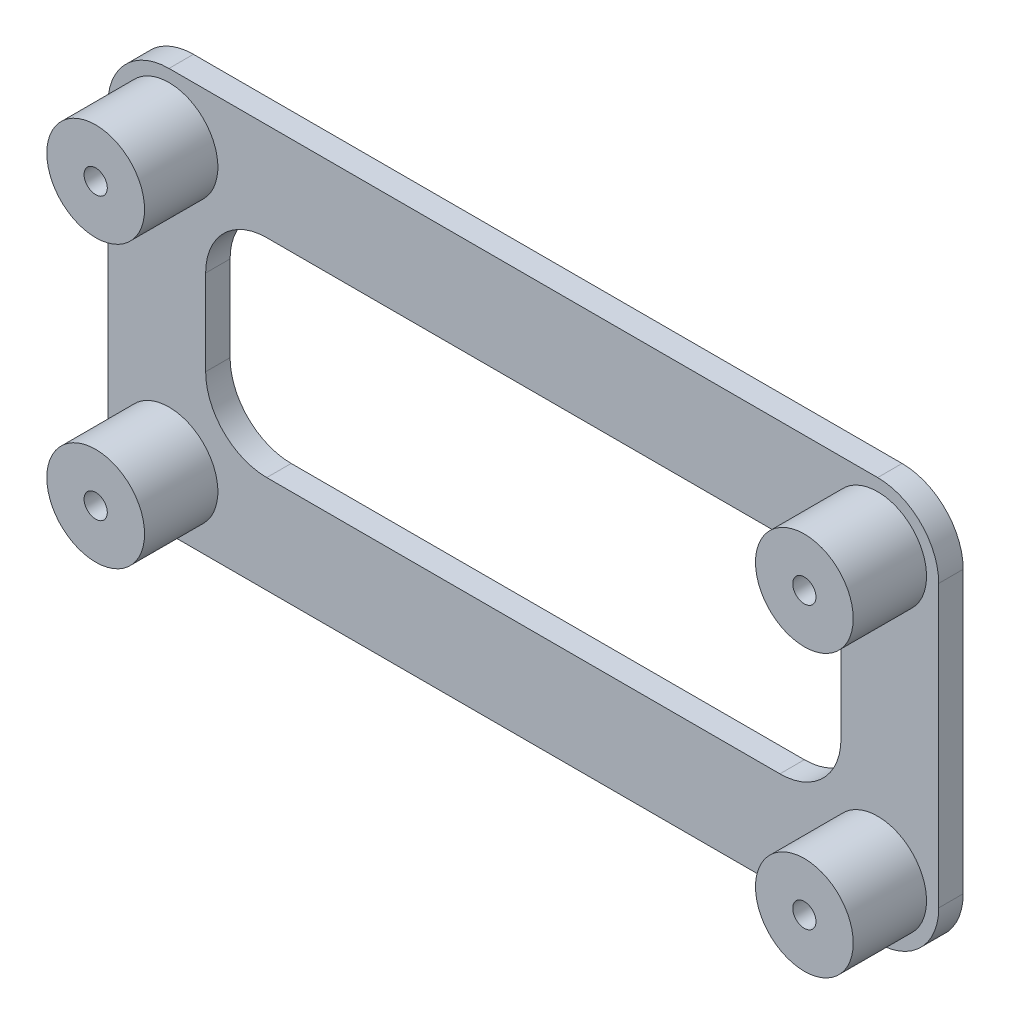
ISO-10303-21;
HEADER;
FILE_DESCRIPTION(('STEP AP214'),'2;1');
FILE_NAME('part.step','',(''),(''),'','','');
FILE_SCHEMA(('AUTOMOTIVE_DESIGN { 1 0 10303 214 1 1 1 1 }'));
ENDSEC;
DATA;
#1=APPLICATION_CONTEXT('core data for automotive mechanical design processes');
#2=APPLICATION_PROTOCOL_DEFINITION('international standard','automotive_design',2000,#1);
#3=PRODUCT_CONTEXT('',#1,'mechanical');
#4=PRODUCT('Part','Part','',(#3));
#5=PRODUCT_RELATED_PRODUCT_CATEGORY('part','',(#4));
#6=PRODUCT_DEFINITION_FORMATION('','',#4);
#7=PRODUCT_DEFINITION_CONTEXT('part definition',#1,'design');
#8=PRODUCT_DEFINITION('design','',#6,#7);
#9=PRODUCT_DEFINITION_SHAPE('','',#8);
#10=(LENGTH_UNIT() NAMED_UNIT(*) SI_UNIT(.MILLI.,.METRE.));
#11=(NAMED_UNIT(*) PLANE_ANGLE_UNIT() SI_UNIT($,.RADIAN.));
#12=(NAMED_UNIT(*) SI_UNIT($,.STERADIAN.) SOLID_ANGLE_UNIT());
#13=UNCERTAINTY_MEASURE_WITH_UNIT(LENGTH_MEASURE(1.E-05),#10,'distance_accuracy_value','');
#14=(GEOMETRIC_REPRESENTATION_CONTEXT(3) GLOBAL_UNCERTAINTY_ASSIGNED_CONTEXT((#13)) GLOBAL_UNIT_ASSIGNED_CONTEXT((#10,
#11,#12)) REPRESENTATION_CONTEXT('',''));
#15=CARTESIAN_POINT('',(0.,0.,0.));
#16=DIRECTION('',(0.,0.,1.));
#17=DIRECTION('',(1.,0.,0.));
#18=AXIS2_PLACEMENT_3D('',#15,#16,#17);
#19=CARTESIAN_POINT('',(0.,0.,2.));
#20=DIRECTION('',(0.,0.,-1.));
#21=DIRECTION('',(-1.,0.,0.));
#22=AXIS2_PLACEMENT_3D('',#19,#20,#21);
#23=PLANE('',#22);
#24=CARTESIAN_POINT('',(29.,-11.5,2.));
#25=DIRECTION('',(0.,0.,-1.));
#26=DIRECTION('',(-1.,0.,0.));
#27=AXIS2_PLACEMENT_3D('',#24,#25,#26);
#28=CIRCLE('',#27,4.);
#29=CARTESIAN_POINT('',(25.,-11.5,2.));
#30=VERTEX_POINT('',#29);
#31=EDGE_CURVE('E187',#30,#30,#28,.F.);
#32=ORIENTED_EDGE('',*,*,#31,.F.);
#33=EDGE_LOOP('',(#32));
#34=FACE_BOUND('',#33,.T.);
#35=CARTESIAN_POINT('',(-29.,11.5,2.));
#36=DIRECTION('',(0.,0.,-1.));
#37=DIRECTION('',(-1.,0.,0.));
#38=AXIS2_PLACEMENT_3D('',#35,#36,#37);
#39=CIRCLE('',#38,4.);
#40=CARTESIAN_POINT('',(-33.,11.5,2.));
#41=VERTEX_POINT('',#40);
#42=EDGE_CURVE('E325',#41,#41,#39,.F.);
#43=ORIENTED_EDGE('',*,*,#42,.F.);
#44=EDGE_LOOP('',(#43));
#45=FACE_BOUND('',#44,.T.);
#46=DIRECTION('',(-1.,0.,0.));
#47=VECTOR('',#46,1.);
#48=CARTESIAN_POINT('',(-34.,16.5,2.));
#49=LINE('',#48,#47);
#50=CARTESIAN_POINT('',(29.,16.5,2.));
#51=VERTEX_POINT('',#50);
#52=CARTESIAN_POINT('',(-29.,16.5,2.));
#53=VERTEX_POINT('',#52);
#54=EDGE_CURVE('E314',#51,#53,#49,.T.);
#55=ORIENTED_EDGE('',*,*,#54,.T.);
#56=CARTESIAN_POINT('',(-29.,11.5,2.));
#57=DIRECTION('',(0.,0.,-1.));
#58=DIRECTION('',(-1.,0.,0.));
#59=AXIS2_PLACEMENT_3D('',#56,#57,#58);
#60=CIRCLE('',#59,5.);
#61=CARTESIAN_POINT('',(-34.,11.5,2.));
#62=VERTEX_POINT('',#61);
#63=EDGE_CURVE('E244',#53,#62,#60,.F.);
#64=ORIENTED_EDGE('',*,*,#63,.T.);
#65=DIRECTION('',(0.,-1.,0.));
#66=VECTOR('',#65,1.);
#67=CARTESIAN_POINT('',(-34.,-16.5,2.));
#68=LINE('',#67,#66);
#69=CARTESIAN_POINT('',(-34.,-11.5,2.));
#70=VERTEX_POINT('',#69);
#71=EDGE_CURVE('E319',#62,#70,#68,.T.);
#72=ORIENTED_EDGE('',*,*,#71,.T.);
#73=CARTESIAN_POINT('',(-29.,-11.5,2.));
#74=DIRECTION('',(0.,0.,-1.));
#75=DIRECTION('',(-1.,0.,0.));
#76=AXIS2_PLACEMENT_3D('',#73,#74,#75);
#77=CIRCLE('',#76,5.);
#78=CARTESIAN_POINT('',(-29.,-16.5,2.));
#79=VERTEX_POINT('',#78);
#80=EDGE_CURVE('E62',#70,#79,#77,.F.);
#81=ORIENTED_EDGE('',*,*,#80,.T.);
#82=DIRECTION('',(1.,0.,0.));
#83=VECTOR('',#82,1.);
#84=CARTESIAN_POINT('',(-34.,-16.5,2.));
#85=LINE('',#84,#83);
#86=CARTESIAN_POINT('',(29.,-16.5,2.));
#87=VERTEX_POINT('',#86);
#88=EDGE_CURVE('E322',#79,#87,#85,.T.);
#89=ORIENTED_EDGE('',*,*,#88,.T.);
#90=CARTESIAN_POINT('',(29.,-11.5,2.));
#91=DIRECTION('',(0.,0.,-1.));
#92=DIRECTION('',(-1.,0.,0.));
#93=AXIS2_PLACEMENT_3D('',#90,#91,#92);
#94=CIRCLE('',#93,5.);
#95=CARTESIAN_POINT('',(34.,-11.5,2.));
#96=VERTEX_POINT('',#95);
#97=EDGE_CURVE('E238',#87,#96,#94,.F.);
#98=ORIENTED_EDGE('',*,*,#97,.T.);
#99=DIRECTION('',(0.,1.,0.));
#100=VECTOR('',#99,1.);
#101=CARTESIAN_POINT('',(34.,-16.5,2.));
#102=LINE('',#101,#100);
#103=CARTESIAN_POINT('',(34.,11.5,2.));
#104=VERTEX_POINT('',#103);
#105=EDGE_CURVE('E310',#96,#104,#102,.T.);
#106=ORIENTED_EDGE('',*,*,#105,.T.);
#107=CARTESIAN_POINT('',(29.,11.5,2.));
#108=DIRECTION('',(0.,0.,-1.));
#109=DIRECTION('',(-1.,0.,0.));
#110=AXIS2_PLACEMENT_3D('',#107,#108,#109);
#111=CIRCLE('',#110,5.);
#112=EDGE_CURVE('E241',#104,#51,#111,.F.);
#113=ORIENTED_EDGE('',*,*,#112,.T.);
#114=EDGE_LOOP('',(#55,#64,#72,#81,#89,#98,#106,#113));
#115=FACE_BOUND('',#114,.T.);
#116=DIRECTION('',(0.,1.,0.));
#117=VECTOR('',#116,1.);
#118=CARTESIAN_POINT('',(26.,-8.5,2.));
#119=LINE('',#118,#117);
#120=CARTESIAN_POINT('',(26.,-3.5,2.));
#121=VERTEX_POINT('',#120);
#122=CARTESIAN_POINT('',(26.,3.5,2.));
#123=VERTEX_POINT('',#122);
#124=EDGE_CURVE('E282',#121,#123,#119,.T.);
#125=ORIENTED_EDGE('',*,*,#124,.F.);
#126=CARTESIAN_POINT('',(21.,-3.5,2.));
#127=DIRECTION('',(0.,0.,-1.));
#128=DIRECTION('',(-1.,0.,0.));
#129=AXIS2_PLACEMENT_3D('',#126,#127,#128);
#130=CIRCLE('',#129,5.);
#131=CARTESIAN_POINT('',(21.,-8.5,2.));
#132=VERTEX_POINT('',#131);
#133=EDGE_CURVE('E269',#121,#132,#130,.T.);
#134=ORIENTED_EDGE('',*,*,#133,.T.);
#135=DIRECTION('',(1.,0.,0.));
#136=VECTOR('',#135,1.);
#137=CARTESIAN_POINT('',(-26.,-8.5,2.));
#138=LINE('',#137,#136);
#139=CARTESIAN_POINT('',(-21.,-8.5,2.));
#140=VERTEX_POINT('',#139);
#141=EDGE_CURVE('E331',#140,#132,#138,.T.);
#142=ORIENTED_EDGE('',*,*,#141,.F.);
#143=CARTESIAN_POINT('',(-21.,-3.5,2.));
#144=DIRECTION('',(0.,0.,-1.));
#145=DIRECTION('',(-1.,0.,0.));
#146=AXIS2_PLACEMENT_3D('',#143,#144,#145);
#147=CIRCLE('',#146,5.);
#148=CARTESIAN_POINT('',(-26.,-3.5,2.));
#149=VERTEX_POINT('',#148);
#150=EDGE_CURVE('E263',#140,#149,#147,.T.);
#151=ORIENTED_EDGE('',*,*,#150,.T.);
#152=DIRECTION('',(0.,-1.,0.));
#153=VECTOR('',#152,1.);
#154=CARTESIAN_POINT('',(-26.,-8.5,2.));
#155=LINE('',#154,#153);
#156=CARTESIAN_POINT('',(-26.,3.5,2.));
#157=VERTEX_POINT('',#156);
#158=EDGE_CURVE('E703',#157,#149,#155,.T.);
#159=ORIENTED_EDGE('',*,*,#158,.F.);
#160=CARTESIAN_POINT('',(-21.,3.5,2.));
#161=DIRECTION('',(0.,0.,-1.));
#162=DIRECTION('',(-1.,0.,0.));
#163=AXIS2_PLACEMENT_3D('',#160,#161,#162);
#164=CIRCLE('',#163,5.);
#165=CARTESIAN_POINT('',(-21.,8.5,2.));
#166=VERTEX_POINT('',#165);
#167=EDGE_CURVE('E11',#157,#166,#164,.T.);
#168=ORIENTED_EDGE('',*,*,#167,.T.);
#169=DIRECTION('',(-1.,0.,0.));
#170=VECTOR('',#169,1.);
#171=CARTESIAN_POINT('',(-26.,8.5,2.));
#172=LINE('',#171,#170);
#173=CARTESIAN_POINT('',(21.,8.5,2.));
#174=VERTEX_POINT('',#173);
#175=EDGE_CURVE('E285',#174,#166,#172,.T.);
#176=ORIENTED_EDGE('',*,*,#175,.F.);
#177=CARTESIAN_POINT('',(21.,3.5,2.));
#178=DIRECTION('',(0.,0.,-1.));
#179=DIRECTION('',(-1.,0.,0.));
#180=AXIS2_PLACEMENT_3D('',#177,#178,#179);
#181=CIRCLE('',#180,5.);
#182=EDGE_CURVE('E165',#174,#123,#181,.T.);
#183=ORIENTED_EDGE('',*,*,#182,.T.);
#184=EDGE_LOOP('',(#125,#134,#142,#151,#159,#168,#176,#183));
#185=FACE_BOUND('',#184,.T.);
#186=CARTESIAN_POINT('',(29.,11.5,2.));
#187=DIRECTION('',(0.,0.,-1.));
#188=DIRECTION('',(-1.,0.,0.));
#189=AXIS2_PLACEMENT_3D('',#186,#187,#188);
#190=CIRCLE('',#189,4.);
#191=CARTESIAN_POINT('',(25.,11.5,2.));
#192=VERTEX_POINT('',#191);
#193=EDGE_CURVE('E344',#192,#192,#190,.F.);
#194=ORIENTED_EDGE('',*,*,#193,.F.);
#195=EDGE_LOOP('',(#194));
#196=FACE_BOUND('',#195,.T.);
#197=CARTESIAN_POINT('',(-29.,-11.5,2.));
#198=DIRECTION('',(0.,0.,-1.));
#199=DIRECTION('',(-1.,0.,0.));
#200=AXIS2_PLACEMENT_3D('',#197,#198,#199);
#201=CIRCLE('',#200,4.);
#202=CARTESIAN_POINT('',(-33.,-11.5,2.));
#203=VERTEX_POINT('',#202);
#204=EDGE_CURVE('E180',#203,#203,#201,.F.);
#205=ORIENTED_EDGE('',*,*,#204,.F.);
#206=EDGE_LOOP('',(#205));
#207=FACE_BOUND('',#206,.T.);
#208=ADVANCED_FACE('F39',(#34,#45,#115,#185,#196,#207),#23,.F.);
#209=CARTESIAN_POINT('',(0.,0.,0.));
#210=DIRECTION('',(0.,0.,-1.));
#211=DIRECTION('',(-1.,0.,0.));
#212=AXIS2_PLACEMENT_3D('',#209,#210,#211);
#213=PLANE('',#212);
#214=CARTESIAN_POINT('',(29.,-11.5,0.));
#215=DIRECTION('',(0.,0.,1.));
#216=DIRECTION('',(1.,0.,0.));
#217=AXIS2_PLACEMENT_3D('',#214,#215,#216);
#218=CIRCLE('',#217,0.950000000000001);
#219=CARTESIAN_POINT('',(29.95,-11.5,0.));
#220=VERTEX_POINT('',#219);
#221=EDGE_CURVE('E691',#220,#220,#218,.T.);
#222=ORIENTED_EDGE('',*,*,#221,.T.);
#223=EDGE_LOOP('',(#222));
#224=FACE_BOUND('',#223,.T.);
#225=CARTESIAN_POINT('',(-29.,11.5,0.));
#226=DIRECTION('',(0.,0.,1.));
#227=DIRECTION('',(1.,0.,0.));
#228=AXIS2_PLACEMENT_3D('',#225,#226,#227);
#229=CIRCLE('',#228,0.950000000000001);
#230=CARTESIAN_POINT('',(-28.05,11.5,0.));
#231=VERTEX_POINT('',#230);
#232=EDGE_CURVE('E303',#231,#231,#229,.T.);
#233=ORIENTED_EDGE('',*,*,#232,.T.);
#234=EDGE_LOOP('',(#233));
#235=FACE_BOUND('',#234,.T.);
#236=DIRECTION('',(0.,-1.,0.));
#237=VECTOR('',#236,1.);
#238=CARTESIAN_POINT('',(-34.,-16.5,0.));
#239=LINE('',#238,#237);
#240=CARTESIAN_POINT('',(-34.,11.5,0.));
#241=VERTEX_POINT('',#240);
#242=CARTESIAN_POINT('',(-34.,-11.5,0.));
#243=VERTEX_POINT('',#242);
#244=EDGE_CURVE('E335',#241,#243,#239,.T.);
#245=ORIENTED_EDGE('',*,*,#244,.F.);
#246=CARTESIAN_POINT('',(-29.,11.5,0.));
#247=DIRECTION('',(0.,0.,-1.));
#248=DIRECTION('',(-1.,0.,0.));
#249=AXIS2_PLACEMENT_3D('',#246,#247,#248);
#250=CIRCLE('',#249,5.);
#251=CARTESIAN_POINT('',(-29.,16.5,0.));
#252=VERTEX_POINT('',#251);
#253=EDGE_CURVE('E226',#241,#252,#250,.T.);
#254=ORIENTED_EDGE('',*,*,#253,.T.);
#255=DIRECTION('',(-1.,0.,0.));
#256=VECTOR('',#255,1.);
#257=CARTESIAN_POINT('',(-34.,16.5,0.));
#258=LINE('',#257,#256);
#259=CARTESIAN_POINT('',(29.,16.5,0.));
#260=VERTEX_POINT('',#259);
#261=EDGE_CURVE('E330',#260,#252,#258,.T.);
#262=ORIENTED_EDGE('',*,*,#261,.F.);
#263=CARTESIAN_POINT('',(29.,11.5,0.));
#264=DIRECTION('',(0.,0.,-1.));
#265=DIRECTION('',(-1.,0.,0.));
#266=AXIS2_PLACEMENT_3D('',#263,#264,#265);
#267=CIRCLE('',#266,5.);
#268=CARTESIAN_POINT('',(34.,11.5,0.));
#269=VERTEX_POINT('',#268);
#270=EDGE_CURVE('E223',#260,#269,#267,.T.);
#271=ORIENTED_EDGE('',*,*,#270,.T.);
#272=DIRECTION('',(0.,1.,0.));
#273=VECTOR('',#272,1.);
#274=CARTESIAN_POINT('',(34.,-16.5,0.));
#275=LINE('',#274,#273);
#276=CARTESIAN_POINT('',(34.,-11.5,0.));
#277=VERTEX_POINT('',#276);
#278=EDGE_CURVE('E326',#277,#269,#275,.T.);
#279=ORIENTED_EDGE('',*,*,#278,.F.);
#280=CARTESIAN_POINT('',(29.,-11.5,0.));
#281=DIRECTION('',(0.,0.,-1.));
#282=DIRECTION('',(-1.,0.,0.));
#283=AXIS2_PLACEMENT_3D('',#280,#281,#282);
#284=CIRCLE('',#283,5.);
#285=CARTESIAN_POINT('',(29.,-16.5,0.));
#286=VERTEX_POINT('',#285);
#287=EDGE_CURVE('E220',#277,#286,#284,.T.);
#288=ORIENTED_EDGE('',*,*,#287,.T.);
#289=DIRECTION('',(1.,0.,0.));
#290=VECTOR('',#289,1.);
#291=CARTESIAN_POINT('',(-34.,-16.5,0.));
#292=LINE('',#291,#290);
#293=CARTESIAN_POINT('',(-29.,-16.5,0.));
#294=VERTEX_POINT('',#293);
#295=EDGE_CURVE('E315',#294,#286,#292,.T.);
#296=ORIENTED_EDGE('',*,*,#295,.F.);
#297=CARTESIAN_POINT('',(-29.,-11.5,0.));
#298=DIRECTION('',(0.,0.,-1.));
#299=DIRECTION('',(-1.,0.,0.));
#300=AXIS2_PLACEMENT_3D('',#297,#298,#299);
#301=CIRCLE('',#300,5.);
#302=EDGE_CURVE('E217',#294,#243,#301,.T.);
#303=ORIENTED_EDGE('',*,*,#302,.T.);
#304=EDGE_LOOP('',(#245,#254,#262,#271,#279,#288,#296,#303));
#305=FACE_BOUND('',#304,.T.);
#306=DIRECTION('',(0.,-1.,0.));
#307=VECTOR('',#306,1.);
#308=CARTESIAN_POINT('',(-26.,-8.5,0.));
#309=LINE('',#308,#307);
#310=CARTESIAN_POINT('',(-26.,3.5,0.));
#311=VERTEX_POINT('',#310);
#312=CARTESIAN_POINT('',(-26.,-3.5,0.));
#313=VERTEX_POINT('',#312);
#314=EDGE_CURVE('E157',#311,#313,#309,.T.);
#315=ORIENTED_EDGE('',*,*,#314,.T.);
#316=CARTESIAN_POINT('',(-21.,-3.5,0.));
#317=DIRECTION('',(0.,0.,-1.));
#318=DIRECTION('',(-1.,0.,0.));
#319=AXIS2_PLACEMENT_3D('',#316,#317,#318);
#320=CIRCLE('',#319,5.);
#321=CARTESIAN_POINT('',(-21.,-8.5,0.));
#322=VERTEX_POINT('',#321);
#323=EDGE_CURVE('E260',#313,#322,#320,.F.);
#324=ORIENTED_EDGE('',*,*,#323,.T.);
#325=DIRECTION('',(1.,0.,0.));
#326=VECTOR('',#325,1.);
#327=CARTESIAN_POINT('',(-26.,-8.5,0.));
#328=LINE('',#327,#326);
#329=CARTESIAN_POINT('',(21.,-8.5,0.));
#330=VERTEX_POINT('',#329);
#331=EDGE_CURVE('E175',#322,#330,#328,.T.);
#332=ORIENTED_EDGE('',*,*,#331,.T.);
#333=CARTESIAN_POINT('',(21.,-3.5,0.));
#334=DIRECTION('',(0.,0.,-1.));
#335=DIRECTION('',(-1.,0.,0.));
#336=AXIS2_PLACEMENT_3D('',#333,#334,#335);
#337=CIRCLE('',#336,5.);
#338=CARTESIAN_POINT('',(26.,-3.5,0.));
#339=VERTEX_POINT('',#338);
#340=EDGE_CURVE('E266',#330,#339,#337,.F.);
#341=ORIENTED_EDGE('',*,*,#340,.T.);
#342=DIRECTION('',(0.,1.,0.));
#343=VECTOR('',#342,1.);
#344=CARTESIAN_POINT('',(26.,-8.5,0.));
#345=LINE('',#344,#343);
#346=CARTESIAN_POINT('',(26.,3.5,0.));
#347=VERTEX_POINT('',#346);
#348=EDGE_CURVE('E297',#339,#347,#345,.T.);
#349=ORIENTED_EDGE('',*,*,#348,.T.);
#350=CARTESIAN_POINT('',(21.,3.5,0.));
#351=DIRECTION('',(0.,0.,-1.));
#352=DIRECTION('',(-1.,0.,0.));
#353=AXIS2_PLACEMENT_3D('',#350,#351,#352);
#354=CIRCLE('',#353,5.);
#355=CARTESIAN_POINT('',(21.,8.5,0.));
#356=VERTEX_POINT('',#355);
#357=EDGE_CURVE('E272',#347,#356,#354,.F.);
#358=ORIENTED_EDGE('',*,*,#357,.T.);
#359=DIRECTION('',(-1.,0.,0.));
#360=VECTOR('',#359,1.);
#361=CARTESIAN_POINT('',(-26.,8.5,0.));
#362=LINE('',#361,#360);
#363=CARTESIAN_POINT('',(-21.,8.5,0.));
#364=VERTEX_POINT('',#363);
#365=EDGE_CURVE('E159',#356,#364,#362,.T.);
#366=ORIENTED_EDGE('',*,*,#365,.T.);
#367=CARTESIAN_POINT('',(-21.,3.5,0.));
#368=DIRECTION('',(0.,0.,-1.));
#369=DIRECTION('',(-1.,0.,0.));
#370=AXIS2_PLACEMENT_3D('',#367,#368,#369);
#371=CIRCLE('',#370,5.);
#372=EDGE_CURVE('E48',#364,#311,#371,.F.);
#373=ORIENTED_EDGE('',*,*,#372,.T.);
#374=EDGE_LOOP('',(#315,#324,#332,#341,#349,#358,#366,#373));
#375=FACE_BOUND('',#374,.T.);
#376=CARTESIAN_POINT('',(29.,11.5,0.));
#377=DIRECTION('',(0.,0.,1.));
#378=DIRECTION('',(1.,0.,0.));
#379=AXIS2_PLACEMENT_3D('',#376,#377,#378);
#380=CIRCLE('',#379,0.950000000000001);
#381=CARTESIAN_POINT('',(29.95,11.5,0.));
#382=VERTEX_POINT('',#381);
#383=EDGE_CURVE('E695',#382,#382,#380,.T.);
#384=ORIENTED_EDGE('',*,*,#383,.T.);
#385=EDGE_LOOP('',(#384));
#386=FACE_BOUND('',#385,.T.);
#387=CARTESIAN_POINT('',(-29.,-11.5,0.));
#388=DIRECTION('',(0.,0.,1.));
#389=DIRECTION('',(1.,0.,0.));
#390=AXIS2_PLACEMENT_3D('',#387,#388,#389);
#391=CIRCLE('',#390,0.950000000000001);
#392=CARTESIAN_POINT('',(-28.05,-11.5,0.));
#393=VERTEX_POINT('',#392);
#394=EDGE_CURVE('E681',#393,#393,#391,.T.);
#395=ORIENTED_EDGE('',*,*,#394,.T.);
#396=EDGE_LOOP('',(#395));
#397=FACE_BOUND('',#396,.T.);
#398=ADVANCED_FACE('F155',(#224,#235,#305,#375,#386,#397),#213,.T.);
#399=CARTESIAN_POINT('',(34.,-16.5,2.));
#400=DIRECTION('',(-1.,0.,0.));
#401=DIRECTION('',(0.,0.,1.));
#402=AXIS2_PLACEMENT_3D('',#399,#400,#401);
#403=PLANE('',#402);
#404=ORIENTED_EDGE('',*,*,#278,.T.);
#405=DIRECTION('',(0.,0.,-1.));
#406=VECTOR('',#405,1.);
#407=CARTESIAN_POINT('',(34.,11.5,2.));
#408=LINE('',#407,#406);
#409=EDGE_CURVE('E251',#269,#104,#408,.F.);
#410=ORIENTED_EDGE('',*,*,#409,.T.);
#411=ORIENTED_EDGE('',*,*,#105,.F.);
#412=DIRECTION('',(0.,0.,-1.));
#413=VECTOR('',#412,1.);
#414=CARTESIAN_POINT('',(34.,-11.5,2.));
#415=LINE('',#414,#413);
#416=EDGE_CURVE('E247',#96,#277,#415,.T.);
#417=ORIENTED_EDGE('',*,*,#416,.T.);
#418=EDGE_LOOP('',(#404,#410,#411,#417));
#419=FACE_BOUND('',#418,.T.);
#420=ADVANCED_FACE('F384',(#419),#403,.F.);
#421=CARTESIAN_POINT('',(-34.,16.5,2.));
#422=DIRECTION('',(0.,-1.,0.));
#423=DIRECTION('',(0.,0.,-1.));
#424=AXIS2_PLACEMENT_3D('',#421,#422,#423);
#425=PLANE('',#424);
#426=ORIENTED_EDGE('',*,*,#261,.T.);
#427=DIRECTION('',(0.,0.,-1.));
#428=VECTOR('',#427,1.);
#429=CARTESIAN_POINT('',(-29.,16.5,2.));
#430=LINE('',#429,#428);
#431=EDGE_CURVE('E233',#252,#53,#430,.F.);
#432=ORIENTED_EDGE('',*,*,#431,.T.);
#433=ORIENTED_EDGE('',*,*,#54,.F.);
#434=DIRECTION('',(0.,0.,-1.));
#435=VECTOR('',#434,1.);
#436=CARTESIAN_POINT('',(29.,16.5,2.));
#437=LINE('',#436,#435);
#438=EDGE_CURVE('E229',#51,#260,#437,.T.);
#439=ORIENTED_EDGE('',*,*,#438,.T.);
#440=EDGE_LOOP('',(#426,#432,#433,#439));
#441=FACE_BOUND('',#440,.T.);
#442=ADVANCED_FACE('F388',(#441),#425,.F.);
#443=CARTESIAN_POINT('',(-34.,-16.5,2.));
#444=DIRECTION('',(1.,0.,0.));
#445=DIRECTION('',(0.,0.,-1.));
#446=AXIS2_PLACEMENT_3D('',#443,#444,#445);
#447=PLANE('',#446);
#448=ORIENTED_EDGE('',*,*,#71,.F.);
#449=DIRECTION('',(0.,0.,-1.));
#450=VECTOR('',#449,1.);
#451=CARTESIAN_POINT('',(-34.,11.5,2.));
#452=LINE('',#451,#450);
#453=EDGE_CURVE('E213',#62,#241,#452,.T.);
#454=ORIENTED_EDGE('',*,*,#453,.T.);
#455=ORIENTED_EDGE('',*,*,#244,.T.);
#456=DIRECTION('',(0.,0.,-1.));
#457=VECTOR('',#456,1.);
#458=CARTESIAN_POINT('',(-34.,-11.5,2.));
#459=LINE('',#458,#457);
#460=EDGE_CURVE('E210',#243,#70,#459,.F.);
#461=ORIENTED_EDGE('',*,*,#460,.T.);
#462=EDGE_LOOP('',(#448,#454,#455,#461));
#463=FACE_BOUND('',#462,.T.);
#464=ADVANCED_FACE('F369',(#463),#447,.F.);
#465=CARTESIAN_POINT('',(-34.,-16.5,2.));
#466=DIRECTION('',(0.,1.,0.));
#467=DIRECTION('',(0.,0.,1.));
#468=AXIS2_PLACEMENT_3D('',#465,#466,#467);
#469=PLANE('',#468);
#470=ORIENTED_EDGE('',*,*,#295,.T.);
#471=DIRECTION('',(0.,0.,-1.));
#472=VECTOR('',#471,1.);
#473=CARTESIAN_POINT('',(29.,-16.5,2.));
#474=LINE('',#473,#472);
#475=EDGE_CURVE('E55',#286,#87,#474,.F.);
#476=ORIENTED_EDGE('',*,*,#475,.T.);
#477=ORIENTED_EDGE('',*,*,#88,.F.);
#478=DIRECTION('',(0.,0.,-1.));
#479=VECTOR('',#478,1.);
#480=CARTESIAN_POINT('',(-29.,-16.5,2.));
#481=LINE('',#480,#479);
#482=EDGE_CURVE('E254',#79,#294,#481,.T.);
#483=ORIENTED_EDGE('',*,*,#482,.T.);
#484=EDGE_LOOP('',(#470,#476,#477,#483));
#485=FACE_BOUND('',#484,.T.);
#486=ADVANCED_FACE('F376',(#485),#469,.F.);
#487=CARTESIAN_POINT('',(26.,-8.5,2.));
#488=DIRECTION('',(-1.,0.,0.));
#489=DIRECTION('',(0.,0.,1.));
#490=AXIS2_PLACEMENT_3D('',#487,#488,#489);
#491=PLANE('',#490);
#492=ORIENTED_EDGE('',*,*,#348,.F.);
#493=DIRECTION('',(0.,0.,-1.));
#494=VECTOR('',#493,1.);
#495=CARTESIAN_POINT('',(26.,-3.5,2.));
#496=LINE('',#495,#494);
#497=EDGE_CURVE('E201',#339,#121,#496,.F.);
#498=ORIENTED_EDGE('',*,*,#497,.T.);
#499=ORIENTED_EDGE('',*,*,#124,.T.);
#500=DIRECTION('',(0.,0.,-1.));
#501=VECTOR('',#500,1.);
#502=CARTESIAN_POINT('',(26.,3.5,0.));
#503=LINE('',#502,#501);
#504=EDGE_CURVE('E197',#123,#347,#503,.T.);
#505=ORIENTED_EDGE('',*,*,#504,.T.);
#506=EDGE_LOOP('',(#492,#498,#499,#505));
#507=FACE_BOUND('',#506,.T.);
#508=ADVANCED_FACE('F291',(#507),#491,.T.);
#509=CARTESIAN_POINT('',(-26.,8.5,2.));
#510=DIRECTION('',(0.,-1.,0.));
#511=DIRECTION('',(0.,0.,-1.));
#512=AXIS2_PLACEMENT_3D('',#509,#510,#511);
#513=PLANE('',#512);
#514=ORIENTED_EDGE('',*,*,#365,.F.);
#515=DIRECTION('',(0.,0.,-1.));
#516=VECTOR('',#515,1.);
#517=CARTESIAN_POINT('',(21.,8.5,2.));
#518=LINE('',#517,#516);
#519=EDGE_CURVE('E207',#356,#174,#518,.F.);
#520=ORIENTED_EDGE('',*,*,#519,.T.);
#521=ORIENTED_EDGE('',*,*,#175,.T.);
#522=DIRECTION('',(0.,0.,-1.));
#523=VECTOR('',#522,1.);
#524=CARTESIAN_POINT('',(-21.,8.5,0.));
#525=LINE('',#524,#523);
#526=EDGE_CURVE('E204',#166,#364,#525,.T.);
#527=ORIENTED_EDGE('',*,*,#526,.T.);
#528=EDGE_LOOP('',(#514,#520,#521,#527));
#529=FACE_BOUND('',#528,.T.);
#530=ADVANCED_FACE('F299',(#529),#513,.T.);
#531=CARTESIAN_POINT('',(-26.,-8.5,2.));
#532=DIRECTION('',(1.,0.,0.));
#533=DIRECTION('',(0.,0.,-1.));
#534=AXIS2_PLACEMENT_3D('',#531,#532,#533);
#535=PLANE('',#534);
#536=ORIENTED_EDGE('',*,*,#158,.T.);
#537=DIRECTION('',(0.,0.,-1.));
#538=VECTOR('',#537,1.);
#539=CARTESIAN_POINT('',(-26.,-3.5,0.));
#540=LINE('',#539,#538);
#541=EDGE_CURVE('E173',#149,#313,#540,.T.);
#542=ORIENTED_EDGE('',*,*,#541,.T.);
#543=ORIENTED_EDGE('',*,*,#314,.F.);
#544=DIRECTION('',(0.,0.,-1.));
#545=VECTOR('',#544,1.);
#546=CARTESIAN_POINT('',(-26.,3.5,2.));
#547=LINE('',#546,#545);
#548=EDGE_CURVE('E170',#311,#157,#547,.F.);
#549=ORIENTED_EDGE('',*,*,#548,.T.);
#550=EDGE_LOOP('',(#536,#542,#543,#549));
#551=FACE_BOUND('',#550,.T.);
#552=ADVANCED_FACE('F169',(#551),#535,.T.);
#553=CARTESIAN_POINT('',(-26.,-8.5,2.));
#554=DIRECTION('',(0.,1.,0.));
#555=DIRECTION('',(0.,0.,1.));
#556=AXIS2_PLACEMENT_3D('',#553,#554,#555);
#557=PLANE('',#556);
#558=ORIENTED_EDGE('',*,*,#331,.F.);
#559=DIRECTION('',(0.,0.,-1.));
#560=VECTOR('',#559,1.);
#561=CARTESIAN_POINT('',(-21.,-8.5,2.));
#562=LINE('',#561,#560);
#563=EDGE_CURVE('E194',#322,#140,#562,.F.);
#564=ORIENTED_EDGE('',*,*,#563,.T.);
#565=ORIENTED_EDGE('',*,*,#141,.T.);
#566=DIRECTION('',(0.,0.,-1.));
#567=VECTOR('',#566,1.);
#568=CARTESIAN_POINT('',(21.,-8.5,0.));
#569=LINE('',#568,#567);
#570=EDGE_CURVE('E184',#132,#330,#569,.T.);
#571=ORIENTED_EDGE('',*,*,#570,.T.);
#572=EDGE_LOOP('',(#558,#564,#565,#571));
#573=FACE_BOUND('',#572,.T.);
#574=ADVANCED_FACE('F468',(#573),#557,.T.);
#575=CARTESIAN_POINT('',(-29.,11.5,2.));
#576=DIRECTION('',(0.,0.,-1.));
#577=DIRECTION('',(-1.,0.,0.));
#578=AXIS2_PLACEMENT_3D('',#575,#576,#577);
#579=CYLINDRICAL_SURFACE('',#578,0.950000000000001);
#580=ORIENTED_EDGE('',*,*,#232,.F.);
#581=EDGE_LOOP('',(#580));
#582=FACE_BOUND('',#581,.T.);
#583=CARTESIAN_POINT('',(-29.,11.5,8.));
#584=DIRECTION('',(0.,0.,1.));
#585=DIRECTION('',(1.,0.,0.));
#586=AXIS2_PLACEMENT_3D('',#583,#584,#585);
#587=CIRCLE('',#586,0.950000000000001);
#588=CARTESIAN_POINT('',(-28.05,11.5,8.));
#589=VERTEX_POINT('',#588);
#590=EDGE_CURVE('E672',#589,#589,#587,.T.);
#591=ORIENTED_EDGE('',*,*,#590,.T.);
#592=EDGE_LOOP('',(#591));
#593=FACE_BOUND('',#592,.T.);
#594=ADVANCED_FACE('F473',(#582,#593),#579,.F.);
#595=CARTESIAN_POINT('',(29.,11.5,2.));
#596=DIRECTION('',(0.,0.,-1.));
#597=DIRECTION('',(-1.,0.,0.));
#598=AXIS2_PLACEMENT_3D('',#595,#596,#597);
#599=CYLINDRICAL_SURFACE('',#598,0.950000000000001);
#600=ORIENTED_EDGE('',*,*,#383,.F.);
#601=EDGE_LOOP('',(#600));
#602=FACE_BOUND('',#601,.T.);
#603=CARTESIAN_POINT('',(29.,11.5,8.));
#604=DIRECTION('',(0.,0.,1.));
#605=DIRECTION('',(1.,0.,0.));
#606=AXIS2_PLACEMENT_3D('',#603,#604,#605);
#607=CIRCLE('',#606,0.950000000000001);
#608=CARTESIAN_POINT('',(29.95,11.5,8.));
#609=VERTEX_POINT('',#608);
#610=EDGE_CURVE('E684',#609,#609,#607,.T.);
#611=ORIENTED_EDGE('',*,*,#610,.T.);
#612=EDGE_LOOP('',(#611));
#613=FACE_BOUND('',#612,.T.);
#614=ADVANCED_FACE('F636',(#602,#613),#599,.F.);
#615=CARTESIAN_POINT('',(29.,-11.5,2.));
#616=DIRECTION('',(0.,0.,-1.));
#617=DIRECTION('',(-1.,0.,0.));
#618=AXIS2_PLACEMENT_3D('',#615,#616,#617);
#619=CYLINDRICAL_SURFACE('',#618,0.950000000000001);
#620=ORIENTED_EDGE('',*,*,#221,.F.);
#621=EDGE_LOOP('',(#620));
#622=FACE_BOUND('',#621,.T.);
#623=CARTESIAN_POINT('',(29.,-11.5,8.));
#624=DIRECTION('',(0.,0.,1.));
#625=DIRECTION('',(1.,0.,0.));
#626=AXIS2_PLACEMENT_3D('',#623,#624,#625);
#627=CIRCLE('',#626,0.950000000000001);
#628=CARTESIAN_POINT('',(29.95,-11.5,8.));
#629=VERTEX_POINT('',#628);
#630=EDGE_CURVE('E723',#629,#629,#627,.T.);
#631=ORIENTED_EDGE('',*,*,#630,.T.);
#632=EDGE_LOOP('',(#631));
#633=FACE_BOUND('',#632,.T.);
#634=ADVANCED_FACE('F626',(#622,#633),#619,.F.);
#635=CARTESIAN_POINT('',(-29.,-11.5,2.));
#636=DIRECTION('',(0.,0.,-1.));
#637=DIRECTION('',(-1.,0.,0.));
#638=AXIS2_PLACEMENT_3D('',#635,#636,#637);
#639=CYLINDRICAL_SURFACE('',#638,0.950000000000001);
#640=ORIENTED_EDGE('',*,*,#394,.F.);
#641=EDGE_LOOP('',(#640));
#642=FACE_BOUND('',#641,.T.);
#643=CARTESIAN_POINT('',(-29.,-11.5,8.));
#644=DIRECTION('',(0.,0.,1.));
#645=DIRECTION('',(1.,0.,0.));
#646=AXIS2_PLACEMENT_3D('',#643,#644,#645);
#647=CIRCLE('',#646,0.950000000000001);
#648=CARTESIAN_POINT('',(-28.05,-11.5,8.));
#649=VERTEX_POINT('',#648);
#650=EDGE_CURVE('E733',#649,#649,#647,.T.);
#651=ORIENTED_EDGE('',*,*,#650,.T.);
#652=EDGE_LOOP('',(#651));
#653=FACE_BOUND('',#652,.T.);
#654=ADVANCED_FACE('F616',(#642,#653),#639,.F.);
#655=CARTESIAN_POINT('',(-29.,11.5,8.));
#656=DIRECTION('',(0.,0.,1.));
#657=DIRECTION('',(1.,0.,0.));
#658=AXIS2_PLACEMENT_3D('',#655,#656,#657);
#659=PLANE('',#658);
#660=CARTESIAN_POINT('',(-29.,11.5,8.));
#661=DIRECTION('',(0.,0.,1.));
#662=DIRECTION('',(1.,0.,0.));
#663=AXIS2_PLACEMENT_3D('',#660,#661,#662);
#664=CIRCLE('',#663,4.);
#665=CARTESIAN_POINT('',(-25.,11.5,8.));
#666=VERTEX_POINT('',#665);
#667=EDGE_CURVE('E675',#666,#666,#664,.T.);
#668=ORIENTED_EDGE('',*,*,#667,.T.);
#669=EDGE_LOOP('',(#668));
#670=FACE_BOUND('',#669,.T.);
#671=ORIENTED_EDGE('',*,*,#590,.F.);
#672=EDGE_LOOP('',(#671));
#673=FACE_BOUND('',#672,.T.);
#674=ADVANCED_FACE('F606',(#670,#673),#659,.T.);
#675=CARTESIAN_POINT('',(-29.,11.5,8.));
#676=DIRECTION('',(0.,0.,-1.));
#677=DIRECTION('',(-1.,0.,0.));
#678=AXIS2_PLACEMENT_3D('',#675,#676,#677);
#679=CYLINDRICAL_SURFACE('',#678,4.);
#680=ORIENTED_EDGE('',*,*,#667,.F.);
#681=EDGE_LOOP('',(#680));
#682=FACE_BOUND('',#681,.T.);
#683=ORIENTED_EDGE('',*,*,#42,.T.);
#684=EDGE_LOOP('',(#683));
#685=FACE_BOUND('',#684,.T.);
#686=ADVANCED_FACE('F596',(#682,#685),#679,.T.);
#687=CARTESIAN_POINT('',(29.,11.5,8.));
#688=DIRECTION('',(0.,0.,1.));
#689=DIRECTION('',(1.,0.,0.));
#690=AXIS2_PLACEMENT_3D('',#687,#688,#689);
#691=PLANE('',#690);
#692=CARTESIAN_POINT('',(29.,11.5,8.));
#693=DIRECTION('',(0.,0.,1.));
#694=DIRECTION('',(1.,0.,0.));
#695=AXIS2_PLACEMENT_3D('',#692,#693,#694);
#696=CIRCLE('',#695,4.);
#697=CARTESIAN_POINT('',(33.,11.5,8.));
#698=VERTEX_POINT('',#697);
#699=EDGE_CURVE('E676',#698,#698,#696,.T.);
#700=ORIENTED_EDGE('',*,*,#699,.T.);
#701=EDGE_LOOP('',(#700));
#702=FACE_BOUND('',#701,.T.);
#703=ORIENTED_EDGE('',*,*,#610,.F.);
#704=EDGE_LOOP('',(#703));
#705=FACE_BOUND('',#704,.T.);
#706=ADVANCED_FACE('F586',(#702,#705),#691,.T.);
#707=CARTESIAN_POINT('',(29.,11.5,8.));
#708=DIRECTION('',(0.,0.,-1.));
#709=DIRECTION('',(-1.,0.,0.));
#710=AXIS2_PLACEMENT_3D('',#707,#708,#709);
#711=CYLINDRICAL_SURFACE('',#710,4.);
#712=ORIENTED_EDGE('',*,*,#699,.F.);
#713=EDGE_LOOP('',(#712));
#714=FACE_BOUND('',#713,.T.);
#715=ORIENTED_EDGE('',*,*,#193,.T.);
#716=EDGE_LOOP('',(#715));
#717=FACE_BOUND('',#716,.T.);
#718=ADVANCED_FACE('F576',(#714,#717),#711,.T.);
#719=CARTESIAN_POINT('',(29.,-11.5,8.));
#720=DIRECTION('',(0.,0.,1.));
#721=DIRECTION('',(1.,0.,0.));
#722=AXIS2_PLACEMENT_3D('',#719,#720,#721);
#723=PLANE('',#722);
#724=CARTESIAN_POINT('',(29.,-11.5,8.));
#725=DIRECTION('',(0.,0.,1.));
#726=DIRECTION('',(1.,0.,0.));
#727=AXIS2_PLACEMENT_3D('',#724,#725,#726);
#728=CIRCLE('',#727,4.);
#729=CARTESIAN_POINT('',(33.,-11.5,8.));
#730=VERTEX_POINT('',#729);
#731=EDGE_CURVE('E720',#730,#730,#728,.T.);
#732=ORIENTED_EDGE('',*,*,#731,.T.);
#733=EDGE_LOOP('',(#732));
#734=FACE_BOUND('',#733,.T.);
#735=ORIENTED_EDGE('',*,*,#630,.F.);
#736=EDGE_LOOP('',(#735));
#737=FACE_BOUND('',#736,.T.);
#738=ADVANCED_FACE('F566',(#734,#737),#723,.T.);
#739=CARTESIAN_POINT('',(29.,-11.5,8.));
#740=DIRECTION('',(0.,0.,-1.));
#741=DIRECTION('',(-1.,0.,0.));
#742=AXIS2_PLACEMENT_3D('',#739,#740,#741);
#743=CYLINDRICAL_SURFACE('',#742,4.);
#744=ORIENTED_EDGE('',*,*,#731,.F.);
#745=EDGE_LOOP('',(#744));
#746=FACE_BOUND('',#745,.T.);
#747=ORIENTED_EDGE('',*,*,#31,.T.);
#748=EDGE_LOOP('',(#747));
#749=FACE_BOUND('',#748,.T.);
#750=ADVANCED_FACE('F351',(#746,#749),#743,.T.);
#751=CARTESIAN_POINT('',(-29.,-11.5,8.));
#752=DIRECTION('',(0.,0.,1.));
#753=DIRECTION('',(1.,0.,0.));
#754=AXIS2_PLACEMENT_3D('',#751,#752,#753);
#755=PLANE('',#754);
#756=CARTESIAN_POINT('',(-29.,-11.5,8.));
#757=DIRECTION('',(0.,0.,1.));
#758=DIRECTION('',(1.,0.,0.));
#759=AXIS2_PLACEMENT_3D('',#756,#757,#758);
#760=CIRCLE('',#759,4.);
#761=CARTESIAN_POINT('',(-25.,-11.5,8.));
#762=VERTEX_POINT('',#761);
#763=EDGE_CURVE('E729',#762,#762,#760,.T.);
#764=ORIENTED_EDGE('',*,*,#763,.T.);
#765=EDGE_LOOP('',(#764));
#766=FACE_BOUND('',#765,.T.);
#767=ORIENTED_EDGE('',*,*,#650,.F.);
#768=EDGE_LOOP('',(#767));
#769=FACE_BOUND('',#768,.T.);
#770=ADVANCED_FACE('F547',(#766,#769),#755,.T.);
#771=CARTESIAN_POINT('',(-29.,-11.5,8.));
#772=DIRECTION('',(0.,0.,-1.));
#773=DIRECTION('',(-1.,0.,0.));
#774=AXIS2_PLACEMENT_3D('',#771,#772,#773);
#775=CYLINDRICAL_SURFACE('',#774,4.);
#776=ORIENTED_EDGE('',*,*,#763,.F.);
#777=EDGE_LOOP('',(#776));
#778=FACE_BOUND('',#777,.T.);
#779=ORIENTED_EDGE('',*,*,#204,.T.);
#780=EDGE_LOOP('',(#779));
#781=FACE_BOUND('',#780,.T.);
#782=ADVANCED_FACE('F403',(#778,#781),#775,.T.);
#783=CARTESIAN_POINT('',(-21.,-3.5,2.));
#784=DIRECTION('',(0.,0.,1.));
#785=DIRECTION('',(1.,0.,0.));
#786=AXIS2_PLACEMENT_3D('',#783,#784,#785);
#787=CYLINDRICAL_SURFACE('',#786,5.);
#788=ORIENTED_EDGE('',*,*,#150,.F.);
#789=ORIENTED_EDGE('',*,*,#563,.F.);
#790=ORIENTED_EDGE('',*,*,#323,.F.);
#791=ORIENTED_EDGE('',*,*,#541,.F.);
#792=EDGE_LOOP('',(#788,#789,#790,#791));
#793=FACE_BOUND('',#792,.T.);
#794=ADVANCED_FACE('F399',(#793),#787,.F.);
#795=CARTESIAN_POINT('',(21.,-3.5,2.));
#796=DIRECTION('',(0.,0.,1.));
#797=DIRECTION('',(1.,0.,0.));
#798=AXIS2_PLACEMENT_3D('',#795,#796,#797);
#799=CYLINDRICAL_SURFACE('',#798,5.);
#800=ORIENTED_EDGE('',*,*,#133,.F.);
#801=ORIENTED_EDGE('',*,*,#497,.F.);
#802=ORIENTED_EDGE('',*,*,#340,.F.);
#803=ORIENTED_EDGE('',*,*,#570,.F.);
#804=EDGE_LOOP('',(#800,#801,#802,#803));
#805=FACE_BOUND('',#804,.T.);
#806=ADVANCED_FACE('F402',(#805),#799,.F.);
#807=CARTESIAN_POINT('',(21.,3.5,2.));
#808=DIRECTION('',(0.,0.,1.));
#809=DIRECTION('',(1.,0.,0.));
#810=AXIS2_PLACEMENT_3D('',#807,#808,#809);
#811=CYLINDRICAL_SURFACE('',#810,5.);
#812=ORIENTED_EDGE('',*,*,#182,.F.);
#813=ORIENTED_EDGE('',*,*,#519,.F.);
#814=ORIENTED_EDGE('',*,*,#357,.F.);
#815=ORIENTED_EDGE('',*,*,#504,.F.);
#816=EDGE_LOOP('',(#812,#813,#814,#815));
#817=FACE_BOUND('',#816,.T.);
#818=ADVANCED_FACE('F296',(#817),#811,.F.);
#819=CARTESIAN_POINT('',(-21.,3.5,2.));
#820=DIRECTION('',(0.,0.,1.));
#821=DIRECTION('',(1.,0.,0.));
#822=AXIS2_PLACEMENT_3D('',#819,#820,#821);
#823=CYLINDRICAL_SURFACE('',#822,5.);
#824=ORIENTED_EDGE('',*,*,#167,.F.);
#825=ORIENTED_EDGE('',*,*,#548,.F.);
#826=ORIENTED_EDGE('',*,*,#372,.F.);
#827=ORIENTED_EDGE('',*,*,#526,.F.);
#828=EDGE_LOOP('',(#824,#825,#826,#827));
#829=FACE_BOUND('',#828,.T.);
#830=ADVANCED_FACE('F178',(#829),#823,.F.);
#831=CARTESIAN_POINT('',(-29.,11.5,2.));
#832=DIRECTION('',(0.,0.,-1.));
#833=DIRECTION('',(-1.,0.,0.));
#834=AXIS2_PLACEMENT_3D('',#831,#832,#833);
#835=CYLINDRICAL_SURFACE('',#834,5.);
#836=ORIENTED_EDGE('',*,*,#63,.F.);
#837=ORIENTED_EDGE('',*,*,#431,.F.);
#838=ORIENTED_EDGE('',*,*,#253,.F.);
#839=ORIENTED_EDGE('',*,*,#453,.F.);
#840=EDGE_LOOP('',(#836,#837,#838,#839));
#841=FACE_BOUND('',#840,.T.);
#842=ADVANCED_FACE('F366',(#841),#835,.T.);
#843=CARTESIAN_POINT('',(29.,11.5,2.));
#844=DIRECTION('',(0.,0.,-1.));
#845=DIRECTION('',(-1.,0.,0.));
#846=AXIS2_PLACEMENT_3D('',#843,#844,#845);
#847=CYLINDRICAL_SURFACE('',#846,5.);
#848=ORIENTED_EDGE('',*,*,#112,.F.);
#849=ORIENTED_EDGE('',*,*,#409,.F.);
#850=ORIENTED_EDGE('',*,*,#270,.F.);
#851=ORIENTED_EDGE('',*,*,#438,.F.);
#852=EDGE_LOOP('',(#848,#849,#850,#851));
#853=FACE_BOUND('',#852,.T.);
#854=ADVANCED_FACE('F387',(#853),#847,.T.);
#855=CARTESIAN_POINT('',(29.,-11.5,2.));
#856=DIRECTION('',(0.,0.,-1.));
#857=DIRECTION('',(-1.,0.,0.));
#858=AXIS2_PLACEMENT_3D('',#855,#856,#857);
#859=CYLINDRICAL_SURFACE('',#858,5.);
#860=ORIENTED_EDGE('',*,*,#97,.F.);
#861=ORIENTED_EDGE('',*,*,#475,.F.);
#862=ORIENTED_EDGE('',*,*,#287,.F.);
#863=ORIENTED_EDGE('',*,*,#416,.F.);
#864=EDGE_LOOP('',(#860,#861,#862,#863));
#865=FACE_BOUND('',#864,.T.);
#866=ADVANCED_FACE('F381',(#865),#859,.T.);
#867=CARTESIAN_POINT('',(-29.,-11.5,2.));
#868=DIRECTION('',(0.,0.,-1.));
#869=DIRECTION('',(-1.,0.,0.));
#870=AXIS2_PLACEMENT_3D('',#867,#868,#869);
#871=CYLINDRICAL_SURFACE('',#870,5.);
#872=ORIENTED_EDGE('',*,*,#80,.F.);
#873=ORIENTED_EDGE('',*,*,#460,.F.);
#874=ORIENTED_EDGE('',*,*,#302,.F.);
#875=ORIENTED_EDGE('',*,*,#482,.F.);
#876=EDGE_LOOP('',(#872,#873,#874,#875));
#877=FACE_BOUND('',#876,.T.);
#878=ADVANCED_FACE('F41',(#877),#871,.T.);
#879=CLOSED_SHELL('',(#208,#398,#420,#442,#464,#486,#508,#530,#552,#574,#594,#614,#634,#654,
#674,#686,#706,#718,#738,#750,#770,#782,#794,#806,#818,#830,#842,#854,#866,#878));
#880=MANIFOLD_SOLID_BREP('B2',#879);
#881=ADVANCED_BREP_SHAPE_REPRESENTATION('',(#18,#880),#14);
#882=SHAPE_DEFINITION_REPRESENTATION(#9,#881);
ENDSEC;
END-ISO-10303-21;
